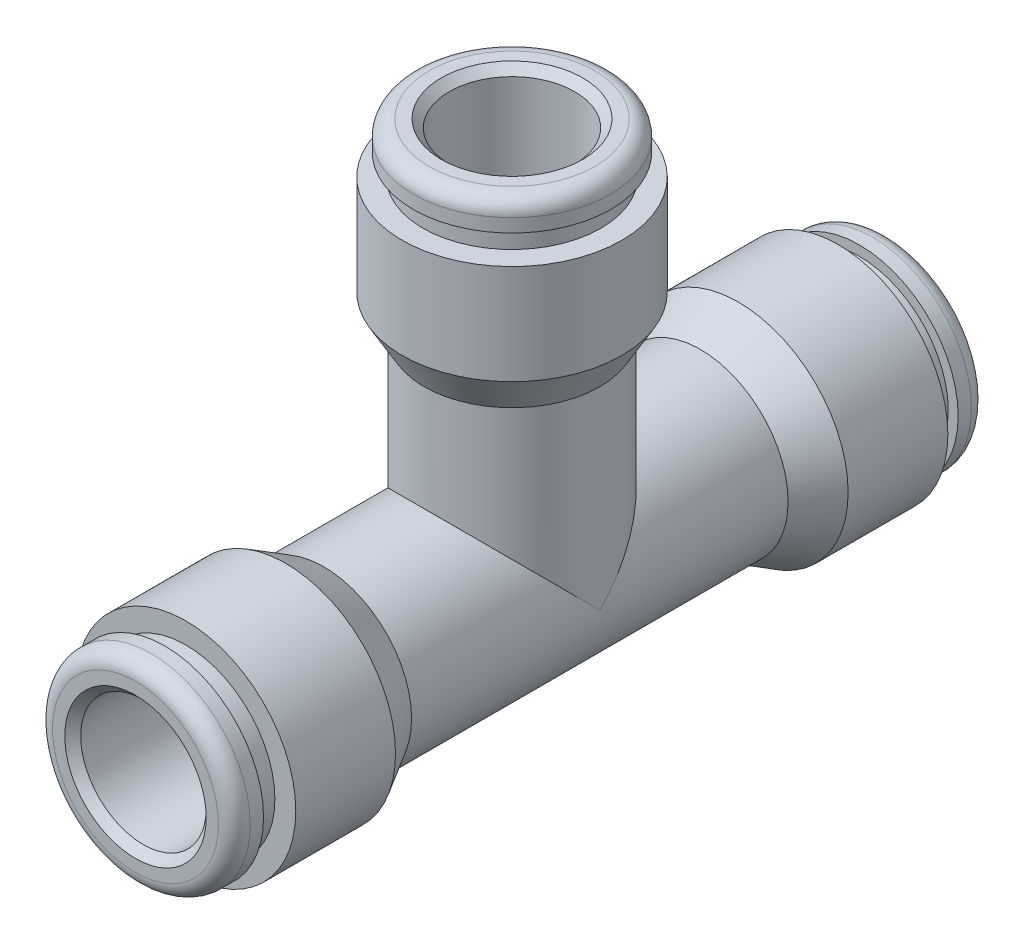
ISO-10303-21;
HEADER;
FILE_DESCRIPTION(('STEP AP214'),'2;1');
FILE_NAME('part.step','',(''),(''),'','','');
FILE_SCHEMA(('AUTOMOTIVE_DESIGN { 1 0 10303 214 1 1 1 1 }'));
ENDSEC;
DATA;
#1=APPLICATION_CONTEXT('core data for automotive mechanical design processes');
#2=APPLICATION_PROTOCOL_DEFINITION('international standard','automotive_design',2000,#1);
#3=PRODUCT_CONTEXT('',#1,'mechanical');
#4=PRODUCT('Part','Part','',(#3));
#5=PRODUCT_RELATED_PRODUCT_CATEGORY('part','',(#4));
#6=PRODUCT_DEFINITION_FORMATION('','',#4);
#7=PRODUCT_DEFINITION_CONTEXT('part definition',#1,'design');
#8=PRODUCT_DEFINITION('design','',#6,#7);
#9=PRODUCT_DEFINITION_SHAPE('','',#8);
#10=(LENGTH_UNIT() NAMED_UNIT(*) SI_UNIT(.MILLI.,.METRE.));
#11=(NAMED_UNIT(*) PLANE_ANGLE_UNIT() SI_UNIT($,.RADIAN.));
#12=(NAMED_UNIT(*) SI_UNIT($,.STERADIAN.) SOLID_ANGLE_UNIT());
#13=UNCERTAINTY_MEASURE_WITH_UNIT(LENGTH_MEASURE(1.E-05),#10,'distance_accuracy_value','');
#14=(GEOMETRIC_REPRESENTATION_CONTEXT(3) GLOBAL_UNCERTAINTY_ASSIGNED_CONTEXT((#13)) GLOBAL_UNIT_ASSIGNED_CONTEXT((#10,
#11,#12)) REPRESENTATION_CONTEXT('',''));
#15=CARTESIAN_POINT('',(0.,0.,0.));
#16=DIRECTION('',(0.,0.,1.));
#17=DIRECTION('',(1.,0.,0.));
#18=AXIS2_PLACEMENT_3D('',#15,#16,#17);
#19=CARTESIAN_POINT('',(0.,0.,0.));
#20=DIRECTION('',(0.,-1.,0.));
#21=DIRECTION('',(0.,0.,-1.));
#22=AXIS2_PLACEMENT_3D('',#19,#20,#21);
#23=CYLINDRICAL_SURFACE('',#22,2.23799999999998);
#24=CARTESIAN_POINT('',(0.,6.,0.));
#25=DIRECTION('',(0.,-1.,0.));
#26=DIRECTION('',(1.,0.,0.));
#27=AXIS2_PLACEMENT_3D('',#24,#25,#26);
#28=CIRCLE('',#27,2.238);
#29=CARTESIAN_POINT('',(2.238,6.,0.));
#30=VERTEX_POINT('',#29);
#31=EDGE_CURVE('E142',#30,#30,#28,.T.);
#32=ORIENTED_EDGE('',*,*,#31,.F.);
#33=EDGE_LOOP('',(#32));
#34=FACE_BOUND('',#33,.T.);
#35=CARTESIAN_POINT('',(0.,0.,0.));
#36=DIRECTION('',(0.,-0.707106781186547,0.707106781186547));
#37=DIRECTION('',(0.,-0.707106781186547,-0.707106781186547));
#38=AXIS2_PLACEMENT_3D('',#35,#36,#37);
#39=ELLIPSE('',#38,3.16500995259097,2.23799999999999);
#40=CARTESIAN_POINT('',(-2.238,0.,0.));
#41=VERTEX_POINT('',#40);
#42=CARTESIAN_POINT('',(2.238,0.,0.));
#43=VERTEX_POINT('',#42);
#44=EDGE_CURVE('E62',#41,#43,#39,.F.);
#45=ORIENTED_EDGE('',*,*,#44,.F.);
#46=CARTESIAN_POINT('',(0.,0.,0.));
#47=DIRECTION('',(0.,-0.707106781186547,-0.707106781186547));
#48=DIRECTION('',(0.,-0.707106781186547,0.707106781186547));
#49=AXIS2_PLACEMENT_3D('',#46,#47,#48);
#50=ELLIPSE('',#49,3.16500995259097,2.23799999999999);
#51=EDGE_CURVE('E66',#43,#41,#50,.F.);
#52=ORIENTED_EDGE('',*,*,#51,.F.);
#53=EDGE_LOOP('',(#45,#52));
#54=FACE_BOUND('',#53,.T.);
#55=ADVANCED_FACE('F39',(#34,#54),#23,.F.);
#56=CARTESIAN_POINT('',(0.,0.,0.));
#57=DIRECTION('',(0.,0.,1.));
#58=DIRECTION('',(1.,0.,0.));
#59=AXIS2_PLACEMENT_3D('',#56,#57,#58);
#60=CYLINDRICAL_SURFACE('',#59,2.238);
#61=ORIENTED_EDGE('',*,*,#44,.T.);
#62=ORIENTED_EDGE('',*,*,#51,.T.);
#63=EDGE_LOOP('',(#61,#62));
#64=FACE_BOUND('',#63,.T.);
#65=CARTESIAN_POINT('',(0.,0.,5.75));
#66=DIRECTION('',(0.,0.,-1.));
#67=DIRECTION('',(1.,0.,0.));
#68=AXIS2_PLACEMENT_3D('',#65,#66,#67);
#69=CIRCLE('',#68,2.238);
#70=CARTESIAN_POINT('',(2.238,0.,5.75));
#71=VERTEX_POINT('',#70);
#72=EDGE_CURVE('E104',#71,#71,#69,.T.);
#73=ORIENTED_EDGE('',*,*,#72,.F.);
#74=EDGE_LOOP('',(#73));
#75=FACE_BOUND('',#74,.T.);
#76=CARTESIAN_POINT('',(0.,0.,-5.75));
#77=DIRECTION('',(0.,0.,1.));
#78=DIRECTION('',(1.,0.,0.));
#79=AXIS2_PLACEMENT_3D('',#76,#77,#78);
#80=CIRCLE('',#79,2.238);
#81=CARTESIAN_POINT('',(2.238,0.,-5.75));
#82=VERTEX_POINT('',#81);
#83=EDGE_CURVE('E47',#82,#82,#80,.T.);
#84=ORIENTED_EDGE('',*,*,#83,.F.);
#85=EDGE_LOOP('',(#84));
#86=FACE_BOUND('',#85,.T.);
#87=ADVANCED_FACE('F64',(#64,#75,#86),#60,.F.);
#88=CARTESIAN_POINT('',(0.,0.,0.));
#89=DIRECTION('',(0.,0.,1.));
#90=DIRECTION('',(1.,0.,0.));
#91=AXIS2_PLACEMENT_3D('',#88,#89,#90);
#92=CYLINDRICAL_SURFACE('',#91,4.2);
#93=CARTESIAN_POINT('',(0.,0.,-9.));
#94=DIRECTION('',(0.,0.,1.));
#95=DIRECTION('',(1.,0.,0.));
#96=AXIS2_PLACEMENT_3D('',#93,#94,#95);
#97=CIRCLE('',#96,4.2);
#98=CARTESIAN_POINT('',(4.2,0.,-9.));
#99=VERTEX_POINT('',#98);
#100=EDGE_CURVE('E175',#99,#99,#97,.T.);
#101=ORIENTED_EDGE('',*,*,#100,.T.);
#102=EDGE_LOOP('',(#101));
#103=FACE_BOUND('',#102,.T.);
#104=CARTESIAN_POINT('',(0.,0.,0.));
#105=DIRECTION('',(0.,0.707106781186546,0.707106781186549));
#106=DIRECTION('',(0.,-0.707106781186549,0.707106781186546));
#107=AXIS2_PLACEMENT_3D('',#104,#105,#106);
#108=ELLIPSE('',#107,5.93969696196699,4.2);
#109=CARTESIAN_POINT('',(4.2,0.,0.));
#110=VERTEX_POINT('',#109);
#111=CARTESIAN_POINT('',(-4.2,0.,0.));
#112=VERTEX_POINT('',#111);
#113=EDGE_CURVE('E11',#110,#112,#108,.T.);
#114=ORIENTED_EDGE('',*,*,#113,.F.);
#115=CARTESIAN_POINT('',(0.,0.,0.));
#116=DIRECTION('',(0.,-0.707106781186551,0.707106781186544));
#117=DIRECTION('',(0.,-0.707106781186544,-0.707106781186551));
#118=AXIS2_PLACEMENT_3D('',#115,#116,#117);
#119=ELLIPSE('',#118,5.93969696196699,4.2);
#120=EDGE_CURVE('E107',#110,#112,#119,.T.);
#121=ORIENTED_EDGE('',*,*,#120,.T.);
#122=EDGE_LOOP('',(#114,#121));
#123=FACE_BOUND('',#122,.T.);
#124=CARTESIAN_POINT('',(0.,0.,9.));
#125=DIRECTION('',(0.,0.,-1.));
#126=DIRECTION('',(1.,0.,0.));
#127=AXIS2_PLACEMENT_3D('',#124,#125,#126);
#128=CIRCLE('',#127,4.2);
#129=CARTESIAN_POINT('',(4.2,0.,9.));
#130=VERTEX_POINT('',#129);
#131=EDGE_CURVE('E101',#130,#130,#128,.T.);
#132=ORIENTED_EDGE('',*,*,#131,.T.);
#133=EDGE_LOOP('',(#132));
#134=FACE_BOUND('',#133,.T.);
#135=ADVANCED_FACE('F182',(#103,#123,#134),#92,.T.);
#136=CARTESIAN_POINT('',(0.,3.,-5.75));
#137=DIRECTION('',(0.,0.,1.));
#138=DIRECTION('',(1.,0.,0.));
#139=AXIS2_PLACEMENT_3D('',#136,#137,#138);
#140=PLANE('',#139);
#141=CARTESIAN_POINT('',(0.,0.,-5.75));
#142=DIRECTION('',(0.,0.,1.));
#143=DIRECTION('',(1.,0.,0.));
#144=AXIS2_PLACEMENT_3D('',#141,#142,#143);
#145=CIRCLE('',#144,3.);
#146=CARTESIAN_POINT('',(3.,0.,-5.75));
#147=VERTEX_POINT('',#146);
#148=EDGE_CURVE('E145',#147,#147,#145,.T.);
#149=ORIENTED_EDGE('',*,*,#148,.F.);
#150=EDGE_LOOP('',(#149));
#151=FACE_BOUND('',#150,.T.);
#152=ORIENTED_EDGE('',*,*,#83,.T.);
#153=EDGE_LOOP('',(#152));
#154=FACE_BOUND('',#153,.T.);
#155=ADVANCED_FACE('F41',(#151,#154),#140,.F.);
#156=CARTESIAN_POINT('',(0.,0.,-10.8186533479473));
#157=DIRECTION('',(0.,0.,-1.));
#158=DIRECTION('',(-1.,0.,0.));
#159=AXIS2_PLACEMENT_3D('',#156,#157,#158);
#160=CONICAL_SURFACE('',#159,5.25,0.523598775598301);
#161=ORIENTED_EDGE('',*,*,#100,.F.);
#162=EDGE_LOOP('',(#161));
#163=FACE_BOUND('',#162,.T.);
#164=CARTESIAN_POINT('',(0.,0.,-10.8186533479473));
#165=DIRECTION('',(0.,0.,1.));
#166=DIRECTION('',(1.,0.,0.));
#167=AXIS2_PLACEMENT_3D('',#164,#165,#166);
#168=CIRCLE('',#167,5.25);
#169=CARTESIAN_POINT('',(5.25,0.,-10.8186533479473));
#170=VERTEX_POINT('',#169);
#171=EDGE_CURVE('E172',#170,#170,#168,.T.);
#172=ORIENTED_EDGE('',*,*,#171,.T.);
#173=EDGE_LOOP('',(#172));
#174=FACE_BOUND('',#173,.T.);
#175=ADVANCED_FACE('F192',(#163,#174),#160,.T.);
#176=CARTESIAN_POINT('',(0.,0.,0.));
#177=DIRECTION('',(0.,0.,1.));
#178=DIRECTION('',(1.,0.,0.));
#179=AXIS2_PLACEMENT_3D('',#176,#177,#178);
#180=CYLINDRICAL_SURFACE('',#179,5.25);
#181=ORIENTED_EDGE('',*,*,#171,.F.);
#182=EDGE_LOOP('',(#181));
#183=FACE_BOUND('',#182,.T.);
#184=CARTESIAN_POINT('',(0.,0.,-15.587));
#185=DIRECTION('',(0.,0.,1.));
#186=DIRECTION('',(1.,0.,0.));
#187=AXIS2_PLACEMENT_3D('',#184,#185,#186);
#188=CIRCLE('',#187,5.25);
#189=CARTESIAN_POINT('',(5.25,0.,-15.587));
#190=VERTEX_POINT('',#189);
#191=EDGE_CURVE('E169',#190,#190,#188,.T.);
#192=ORIENTED_EDGE('',*,*,#191,.T.);
#193=EDGE_LOOP('',(#192));
#194=FACE_BOUND('',#193,.T.);
#195=ADVANCED_FACE('F195',(#183,#194),#180,.T.);
#196=CARTESIAN_POINT('',(0.,5.25,-15.587));
#197=DIRECTION('',(0.,0.,1.));
#198=DIRECTION('',(1.,0.,0.));
#199=AXIS2_PLACEMENT_3D('',#196,#197,#198);
#200=PLANE('',#199);
#201=ORIENTED_EDGE('',*,*,#191,.F.);
#202=EDGE_LOOP('',(#201));
#203=FACE_BOUND('',#202,.T.);
#204=CARTESIAN_POINT('',(0.,0.,-15.587));
#205=DIRECTION('',(0.,0.,1.));
#206=DIRECTION('',(1.,0.,0.));
#207=AXIS2_PLACEMENT_3D('',#204,#205,#206);
#208=CIRCLE('',#207,4.2525);
#209=CARTESIAN_POINT('',(4.2525,0.,-15.587));
#210=VERTEX_POINT('',#209);
#211=EDGE_CURVE('E166',#210,#210,#208,.T.);
#212=ORIENTED_EDGE('',*,*,#211,.T.);
#213=EDGE_LOOP('',(#212));
#214=FACE_BOUND('',#213,.T.);
#215=ADVANCED_FACE('F199',(#203,#214),#200,.F.);
#216=CARTESIAN_POINT('',(0.,0.,0.));
#217=DIRECTION('',(0.,0.,1.));
#218=DIRECTION('',(1.,0.,0.));
#219=AXIS2_PLACEMENT_3D('',#216,#217,#218);
#220=CYLINDRICAL_SURFACE('',#219,4.2525);
#221=ORIENTED_EDGE('',*,*,#211,.F.);
#222=EDGE_LOOP('',(#221));
#223=FACE_BOUND('',#222,.T.);
#224=CARTESIAN_POINT('',(0.,0.,-16.603));
#225=DIRECTION('',(0.,0.,1.));
#226=DIRECTION('',(1.,0.,0.));
#227=AXIS2_PLACEMENT_3D('',#224,#225,#226);
#228=CIRCLE('',#227,4.2525);
#229=CARTESIAN_POINT('',(4.2525,0.,-16.603));
#230=VERTEX_POINT('',#229);
#231=EDGE_CURVE('E163',#230,#230,#228,.T.);
#232=ORIENTED_EDGE('',*,*,#231,.T.);
#233=EDGE_LOOP('',(#232));
#234=FACE_BOUND('',#233,.T.);
#235=ADVANCED_FACE('F203',(#223,#234),#220,.T.);
#236=CARTESIAN_POINT('',(0.,4.725,-16.603));
#237=DIRECTION('',(0.,0.,-1.));
#238=DIRECTION('',(-1.,0.,0.));
#239=AXIS2_PLACEMENT_3D('',#236,#237,#238);
#240=PLANE('',#239);
#241=ORIENTED_EDGE('',*,*,#231,.F.);
#242=EDGE_LOOP('',(#241));
#243=FACE_BOUND('',#242,.T.);
#244=CARTESIAN_POINT('',(0.,0.,-16.603));
#245=DIRECTION('',(0.,0.,1.));
#246=DIRECTION('',(1.,0.,0.));
#247=AXIS2_PLACEMENT_3D('',#244,#245,#246);
#248=CIRCLE('',#247,4.725);
#249=CARTESIAN_POINT('',(4.725,0.,-16.603));
#250=VERTEX_POINT('',#249);
#251=EDGE_CURVE('E160',#250,#250,#248,.T.);
#252=ORIENTED_EDGE('',*,*,#251,.T.);
#253=EDGE_LOOP('',(#252));
#254=FACE_BOUND('',#253,.T.);
#255=ADVANCED_FACE('F207',(#243,#254),#240,.F.);
#256=CARTESIAN_POINT('',(0.,0.,0.));
#257=DIRECTION('',(0.,0.,1.));
#258=DIRECTION('',(1.,0.,0.));
#259=AXIS2_PLACEMENT_3D('',#256,#257,#258);
#260=CYLINDRICAL_SURFACE('',#259,4.725);
#261=ORIENTED_EDGE('',*,*,#251,.F.);
#262=EDGE_LOOP('',(#261));
#263=FACE_BOUND('',#262,.T.);
#264=CARTESIAN_POINT('',(0.,0.,-17.238));
#265=DIRECTION('',(0.,0.,1.));
#266=DIRECTION('',(1.,0.,0.));
#267=AXIS2_PLACEMENT_3D('',#264,#265,#266);
#268=CIRCLE('',#267,4.725);
#269=CARTESIAN_POINT('',(4.725,0.,-17.238));
#270=VERTEX_POINT('',#269);
#271=EDGE_CURVE('E157',#270,#270,#268,.T.);
#272=ORIENTED_EDGE('',*,*,#271,.T.);
#273=EDGE_LOOP('',(#272));
#274=FACE_BOUND('',#273,.T.);
#275=ADVANCED_FACE('F211',(#263,#274),#260,.T.);
#276=CARTESIAN_POINT('',(0.,0.,-17.238));
#277=DIRECTION('',(0.,0.,1.));
#278=DIRECTION('',(1.,0.,0.));
#279=AXIS2_PLACEMENT_3D('',#276,#277,#278);
#280=TOROIDAL_SURFACE('',#279,3.963,0.761999999999999);
#281=ORIENTED_EDGE('',*,*,#271,.F.);
#282=EDGE_LOOP('',(#281));
#283=FACE_BOUND('',#282,.T.);
#284=CARTESIAN_POINT('',(0.,0.,-18.));
#285=DIRECTION('',(0.,0.,1.));
#286=DIRECTION('',(1.,0.,0.));
#287=AXIS2_PLACEMENT_3D('',#284,#285,#286);
#288=CIRCLE('',#287,3.963);
#289=CARTESIAN_POINT('',(3.963,0.,-18.));
#290=VERTEX_POINT('',#289);
#291=EDGE_CURVE('E154',#290,#290,#288,.T.);
#292=ORIENTED_EDGE('',*,*,#291,.T.);
#293=EDGE_LOOP('',(#292));
#294=FACE_BOUND('',#293,.T.);
#295=ADVANCED_FACE('F215',(#283,#294),#280,.T.);
#296=CARTESIAN_POINT('',(0.,3.963,-18.));
#297=DIRECTION('',(0.,0.,1.));
#298=DIRECTION('',(1.,0.,0.));
#299=AXIS2_PLACEMENT_3D('',#296,#297,#298);
#300=PLANE('',#299);
#301=ORIENTED_EDGE('',*,*,#291,.F.);
#302=EDGE_LOOP('',(#301));
#303=FACE_BOUND('',#302,.T.);
#304=CARTESIAN_POINT('',(0.,0.,-18.));
#305=DIRECTION('',(0.,0.,1.));
#306=DIRECTION('',(1.,0.,0.));
#307=AXIS2_PLACEMENT_3D('',#304,#305,#306);
#308=CIRCLE('',#307,3.381);
#309=CARTESIAN_POINT('',(3.381,0.,-18.));
#310=VERTEX_POINT('',#309);
#311=EDGE_CURVE('E151',#310,#310,#308,.T.);
#312=ORIENTED_EDGE('',*,*,#311,.T.);
#313=EDGE_LOOP('',(#312));
#314=FACE_BOUND('',#313,.T.);
#315=ADVANCED_FACE('F219',(#303,#314),#300,.F.);
#316=CARTESIAN_POINT('',(0.,0.,-17.619));
#317=DIRECTION('',(0.,0.,-1.));
#318=DIRECTION('',(-1.,0.,0.));
#319=AXIS2_PLACEMENT_3D('',#316,#317,#318);
#320=CONICAL_SURFACE('',#319,3.,0.785398163397449);
#321=ORIENTED_EDGE('',*,*,#311,.F.);
#322=EDGE_LOOP('',(#321));
#323=FACE_BOUND('',#322,.T.);
#324=CARTESIAN_POINT('',(0.,0.,-17.619));
#325=DIRECTION('',(0.,0.,1.));
#326=DIRECTION('',(1.,0.,0.));
#327=AXIS2_PLACEMENT_3D('',#324,#325,#326);
#328=CIRCLE('',#327,3.);
#329=CARTESIAN_POINT('',(3.,0.,-17.619));
#330=VERTEX_POINT('',#329);
#331=EDGE_CURVE('E148',#330,#330,#328,.T.);
#332=ORIENTED_EDGE('',*,*,#331,.T.);
#333=EDGE_LOOP('',(#332));
#334=FACE_BOUND('',#333,.T.);
#335=ADVANCED_FACE('F223',(#323,#334),#320,.F.);
#336=CARTESIAN_POINT('',(0.,0.,0.));
#337=DIRECTION('',(0.,0.,1.));
#338=DIRECTION('',(1.,0.,0.));
#339=AXIS2_PLACEMENT_3D('',#336,#337,#338);
#340=CYLINDRICAL_SURFACE('',#339,3.);
#341=ORIENTED_EDGE('',*,*,#331,.F.);
#342=EDGE_LOOP('',(#341));
#343=FACE_BOUND('',#342,.T.);
#344=ORIENTED_EDGE('',*,*,#148,.T.);
#345=EDGE_LOOP('',(#344));
#346=FACE_BOUND('',#345,.T.);
#347=ADVANCED_FACE('F227',(#343,#346),#340,.F.);
#348=CARTESIAN_POINT('',(0.,0.,0.));
#349=DIRECTION('',(0.,0.,-1.));
#350=DIRECTION('',(1.,0.,0.));
#351=AXIS2_PLACEMENT_3D('',#348,#349,#350);
#352=CYLINDRICAL_SURFACE('',#351,3.);
#353=CARTESIAN_POINT('',(0.,-1.23032819418154E-13,17.619));
#354=DIRECTION('',(0.,0.,-1.));
#355=DIRECTION('',(1.,0.,0.));
#356=AXIS2_PLACEMENT_3D('',#353,#354,#355);
#357=CIRCLE('',#356,3.);
#358=CARTESIAN_POINT('',(3.,-1.23032819418154E-13,17.619));
#359=VERTEX_POINT('',#358);
#360=EDGE_CURVE('E72',#359,#359,#357,.T.);
#361=ORIENTED_EDGE('',*,*,#360,.F.);
#362=EDGE_LOOP('',(#361));
#363=FACE_BOUND('',#362,.T.);
#364=CARTESIAN_POINT('',(0.,0.,5.75));
#365=DIRECTION('',(0.,0.,-1.));
#366=DIRECTION('',(1.,0.,0.));
#367=AXIS2_PLACEMENT_3D('',#364,#365,#366);
#368=CIRCLE('',#367,3.);
#369=CARTESIAN_POINT('',(3.,0.,5.75));
#370=VERTEX_POINT('',#369);
#371=EDGE_CURVE('E69',#370,#370,#368,.T.);
#372=ORIENTED_EDGE('',*,*,#371,.T.);
#373=EDGE_LOOP('',(#372));
#374=FACE_BOUND('',#373,.T.);
#375=ADVANCED_FACE('F230',(#363,#374),#352,.F.);
#376=CARTESIAN_POINT('',(0.,-1.23032819418154E-13,17.619));
#377=DIRECTION('',(0.,0.,1.));
#378=DIRECTION('',(-1.,0.,0.));
#379=AXIS2_PLACEMENT_3D('',#376,#377,#378);
#380=CONICAL_SURFACE('',#379,3.,0.785398163397449);
#381=CARTESIAN_POINT('',(0.,-1.25693328198353E-13,18.));
#382=DIRECTION('',(0.,0.,-1.));
#383=DIRECTION('',(1.,0.,0.));
#384=AXIS2_PLACEMENT_3D('',#381,#382,#383);
#385=CIRCLE('',#384,3.381);
#386=CARTESIAN_POINT('',(3.381,-1.25693328198353E-13,18.));
#387=VERTEX_POINT('',#386);
#388=EDGE_CURVE('E77',#387,#387,#385,.T.);
#389=ORIENTED_EDGE('',*,*,#388,.F.);
#390=EDGE_LOOP('',(#389));
#391=FACE_BOUND('',#390,.T.);
#392=ORIENTED_EDGE('',*,*,#360,.T.);
#393=EDGE_LOOP('',(#392));
#394=FACE_BOUND('',#393,.T.);
#395=ADVANCED_FACE('F316',(#391,#394),#380,.F.);
#396=CARTESIAN_POINT('',(0.,-3.96300000000013,18.));
#397=DIRECTION('',(0.,0.,-1.));
#398=DIRECTION('',(1.,0.,0.));
#399=AXIS2_PLACEMENT_3D('',#396,#397,#398);
#400=PLANE('',#399);
#401=CARTESIAN_POINT('',(0.,-1.25693328198353E-13,18.));
#402=DIRECTION('',(0.,0.,-1.));
#403=DIRECTION('',(1.,0.,0.));
#404=AXIS2_PLACEMENT_3D('',#401,#402,#403);
#405=CIRCLE('',#404,3.963);
#406=CARTESIAN_POINT('',(3.963,-1.25693328198353E-13,18.));
#407=VERTEX_POINT('',#406);
#408=EDGE_CURVE('E80',#407,#407,#405,.T.);
#409=ORIENTED_EDGE('',*,*,#408,.F.);
#410=EDGE_LOOP('',(#409));
#411=FACE_BOUND('',#410,.T.);
#412=ORIENTED_EDGE('',*,*,#388,.T.);
#413=EDGE_LOOP('',(#412));
#414=FACE_BOUND('',#413,.T.);
#415=ADVANCED_FACE('F312',(#411,#414),#400,.F.);
#416=CARTESIAN_POINT('',(0.,-1.20372310637956E-13,17.238));
#417=DIRECTION('',(0.,0.,-1.));
#418=DIRECTION('',(1.,0.,0.));
#419=AXIS2_PLACEMENT_3D('',#416,#417,#418);
#420=TOROIDAL_SURFACE('',#419,3.963,0.761999999999999);
#421=CARTESIAN_POINT('',(0.,-1.20372310637956E-13,17.238));
#422=DIRECTION('',(0.,0.,-1.));
#423=DIRECTION('',(1.,0.,0.));
#424=AXIS2_PLACEMENT_3D('',#421,#422,#423);
#425=CIRCLE('',#424,4.725);
#426=CARTESIAN_POINT('',(4.725,-1.20372310637956E-13,17.238));
#427=VERTEX_POINT('',#426);
#428=EDGE_CURVE('E83',#427,#427,#425,.T.);
#429=ORIENTED_EDGE('',*,*,#428,.F.);
#430=EDGE_LOOP('',(#429));
#431=FACE_BOUND('',#430,.T.);
#432=ORIENTED_EDGE('',*,*,#408,.T.);
#433=EDGE_LOOP('',(#432));
#434=FACE_BOUND('',#433,.T.);
#435=ADVANCED_FACE('F308',(#431,#434),#420,.T.);
#436=CARTESIAN_POINT('',(0.,0.,0.));
#437=DIRECTION('',(0.,0.,-1.));
#438=DIRECTION('',(1.,0.,0.));
#439=AXIS2_PLACEMENT_3D('',#436,#437,#438);
#440=CYLINDRICAL_SURFACE('',#439,4.725);
#441=CARTESIAN_POINT('',(0.,-1.15938129337625E-13,16.603));
#442=DIRECTION('',(0.,0.,-1.));
#443=DIRECTION('',(1.,0.,0.));
#444=AXIS2_PLACEMENT_3D('',#441,#442,#443);
#445=CIRCLE('',#444,4.725);
#446=CARTESIAN_POINT('',(4.725,-1.15938129337625E-13,16.603));
#447=VERTEX_POINT('',#446);
#448=EDGE_CURVE('E86',#447,#447,#445,.T.);
#449=ORIENTED_EDGE('',*,*,#448,.F.);
#450=EDGE_LOOP('',(#449));
#451=FACE_BOUND('',#450,.T.);
#452=ORIENTED_EDGE('',*,*,#428,.T.);
#453=EDGE_LOOP('',(#452));
#454=FACE_BOUND('',#453,.T.);
#455=ADVANCED_FACE('F304',(#451,#454),#440,.T.);
#456=CARTESIAN_POINT('',(0.,-4.72500000000012,16.603));
#457=DIRECTION('',(0.,0.,1.));
#458=DIRECTION('',(-1.,0.,0.));
#459=AXIS2_PLACEMENT_3D('',#456,#457,#458);
#460=PLANE('',#459);
#461=CARTESIAN_POINT('',(0.,-1.15938129337625E-13,16.603));
#462=DIRECTION('',(0.,0.,-1.));
#463=DIRECTION('',(1.,0.,0.));
#464=AXIS2_PLACEMENT_3D('',#461,#462,#463);
#465=CIRCLE('',#464,4.2525);
#466=CARTESIAN_POINT('',(4.2525,-1.15938129337625E-13,16.603));
#467=VERTEX_POINT('',#466);
#468=EDGE_CURVE('E89',#467,#467,#465,.T.);
#469=ORIENTED_EDGE('',*,*,#468,.F.);
#470=EDGE_LOOP('',(#469));
#471=FACE_BOUND('',#470,.T.);
#472=ORIENTED_EDGE('',*,*,#448,.T.);
#473=EDGE_LOOP('',(#472));
#474=FACE_BOUND('',#473,.T.);
#475=ADVANCED_FACE('F300',(#471,#474),#460,.F.);
#476=CARTESIAN_POINT('',(0.,0.,0.));
#477=DIRECTION('',(0.,0.,-1.));
#478=DIRECTION('',(1.,0.,0.));
#479=AXIS2_PLACEMENT_3D('',#476,#477,#478);
#480=CYLINDRICAL_SURFACE('',#479,4.2525);
#481=CARTESIAN_POINT('',(0.,-1.08843439257096E-13,15.587));
#482=DIRECTION('',(0.,0.,-1.));
#483=DIRECTION('',(1.,0.,0.));
#484=AXIS2_PLACEMENT_3D('',#481,#482,#483);
#485=CIRCLE('',#484,4.2525);
#486=CARTESIAN_POINT('',(4.2525,-1.08843439257096E-13,15.587));
#487=VERTEX_POINT('',#486);
#488=EDGE_CURVE('E92',#487,#487,#485,.T.);
#489=ORIENTED_EDGE('',*,*,#488,.F.);
#490=EDGE_LOOP('',(#489));
#491=FACE_BOUND('',#490,.T.);
#492=ORIENTED_EDGE('',*,*,#468,.T.);
#493=EDGE_LOOP('',(#492));
#494=FACE_BOUND('',#493,.T.);
#495=ADVANCED_FACE('F296',(#491,#494),#480,.T.);
#496=CARTESIAN_POINT('',(0.,-5.25000000000011,15.587));
#497=DIRECTION('',(0.,0.,-1.));
#498=DIRECTION('',(1.,0.,0.));
#499=AXIS2_PLACEMENT_3D('',#496,#497,#498);
#500=PLANE('',#499);
#501=CARTESIAN_POINT('',(0.,-1.08843439257096E-13,15.587));
#502=DIRECTION('',(0.,0.,-1.));
#503=DIRECTION('',(1.,0.,0.));
#504=AXIS2_PLACEMENT_3D('',#501,#502,#503);
#505=CIRCLE('',#504,5.25);
#506=CARTESIAN_POINT('',(5.25,-1.08843439257096E-13,15.587));
#507=VERTEX_POINT('',#506);
#508=EDGE_CURVE('E95',#507,#507,#505,.T.);
#509=ORIENTED_EDGE('',*,*,#508,.F.);
#510=EDGE_LOOP('',(#509));
#511=FACE_BOUND('',#510,.T.);
#512=ORIENTED_EDGE('',*,*,#488,.T.);
#513=EDGE_LOOP('',(#512));
#514=FACE_BOUND('',#513,.T.);
#515=ADVANCED_FACE('F292',(#511,#514),#500,.F.);
#516=CARTESIAN_POINT('',(0.,0.,0.));
#517=DIRECTION('',(0.,0.,-1.));
#518=DIRECTION('',(1.,0.,0.));
#519=AXIS2_PLACEMENT_3D('',#516,#517,#518);
#520=CYLINDRICAL_SURFACE('',#519,5.25);
#521=CARTESIAN_POINT('',(0.,0.,10.8186533479473));
#522=DIRECTION('',(0.,0.,-1.));
#523=DIRECTION('',(1.,0.,0.));
#524=AXIS2_PLACEMENT_3D('',#521,#522,#523);
#525=CIRCLE('',#524,5.25);
#526=CARTESIAN_POINT('',(5.25,0.,10.8186533479473));
#527=VERTEX_POINT('',#526);
#528=EDGE_CURVE('E98',#527,#527,#525,.T.);
#529=ORIENTED_EDGE('',*,*,#528,.F.);
#530=EDGE_LOOP('',(#529));
#531=FACE_BOUND('',#530,.T.);
#532=ORIENTED_EDGE('',*,*,#508,.T.);
#533=EDGE_LOOP('',(#532));
#534=FACE_BOUND('',#533,.T.);
#535=ADVANCED_FACE('F288',(#531,#534),#520,.T.);
#536=CARTESIAN_POINT('',(0.,0.,10.8186533479473));
#537=DIRECTION('',(0.,0.,1.));
#538=DIRECTION('',(-1.,0.,0.));
#539=AXIS2_PLACEMENT_3D('',#536,#537,#538);
#540=CONICAL_SURFACE('',#539,5.25,0.523598775598301);
#541=ORIENTED_EDGE('',*,*,#131,.F.);
#542=EDGE_LOOP('',(#541));
#543=FACE_BOUND('',#542,.T.);
#544=ORIENTED_EDGE('',*,*,#528,.T.);
#545=EDGE_LOOP('',(#544));
#546=FACE_BOUND('',#545,.T.);
#547=ADVANCED_FACE('F284',(#543,#546),#540,.T.);
#548=CARTESIAN_POINT('',(0.,-3.00000000000004,5.74999999999998));
#549=DIRECTION('',(0.,0.,-1.));
#550=DIRECTION('',(1.,0.,0.));
#551=AXIS2_PLACEMENT_3D('',#548,#549,#550);
#552=PLANE('',#551);
#553=ORIENTED_EDGE('',*,*,#371,.F.);
#554=EDGE_LOOP('',(#553));
#555=FACE_BOUND('',#554,.T.);
#556=ORIENTED_EDGE('',*,*,#72,.T.);
#557=EDGE_LOOP('',(#556));
#558=FACE_BOUND('',#557,.T.);
#559=ADVANCED_FACE('F280',(#555,#558),#552,.F.);
#560=CARTESIAN_POINT('',(0.,0.25,0.));
#561=DIRECTION('',(0.,-1.,0.));
#562=DIRECTION('',(1.,0.,0.));
#563=AXIS2_PLACEMENT_3D('',#560,#561,#562);
#564=CYLINDRICAL_SURFACE('',#563,3.);
#565=CARTESIAN_POINT('',(0.,17.869,0.));
#566=DIRECTION('',(0.,-1.,0.));
#567=DIRECTION('',(1.,0.,0.));
#568=AXIS2_PLACEMENT_3D('',#565,#566,#567);
#569=CIRCLE('',#568,3.);
#570=CARTESIAN_POINT('',(3.,17.869,0.));
#571=VERTEX_POINT('',#570);
#572=EDGE_CURVE('E112',#571,#571,#569,.T.);
#573=ORIENTED_EDGE('',*,*,#572,.F.);
#574=EDGE_LOOP('',(#573));
#575=FACE_BOUND('',#574,.T.);
#576=CARTESIAN_POINT('',(0.,6.,0.));
#577=DIRECTION('',(0.,-1.,0.));
#578=DIRECTION('',(1.,0.,0.));
#579=AXIS2_PLACEMENT_3D('',#576,#577,#578);
#580=CIRCLE('',#579,3.);
#581=CARTESIAN_POINT('',(3.,6.,0.));
#582=VERTEX_POINT('',#581);
#583=EDGE_CURVE('E109',#582,#582,#580,.T.);
#584=ORIENTED_EDGE('',*,*,#583,.T.);
#585=EDGE_LOOP('',(#584));
#586=FACE_BOUND('',#585,.T.);
#587=ADVANCED_FACE('F276',(#575,#586),#564,.F.);
#588=CARTESIAN_POINT('',(0.,17.869,0.));
#589=DIRECTION('',(0.,1.,0.));
#590=DIRECTION('',(-1.,0.,0.));
#591=AXIS2_PLACEMENT_3D('',#588,#589,#590);
#592=CONICAL_SURFACE('',#591,3.,0.785398163397449);
#593=CARTESIAN_POINT('',(0.,18.25,0.));
#594=DIRECTION('',(0.,-1.,0.));
#595=DIRECTION('',(1.,0.,0.));
#596=AXIS2_PLACEMENT_3D('',#593,#594,#595);
#597=CIRCLE('',#596,3.381);
#598=CARTESIAN_POINT('',(3.381,18.25,0.));
#599=VERTEX_POINT('',#598);
#600=EDGE_CURVE('E115',#599,#599,#597,.T.);
#601=ORIENTED_EDGE('',*,*,#600,.F.);
#602=EDGE_LOOP('',(#601));
#603=FACE_BOUND('',#602,.T.);
#604=ORIENTED_EDGE('',*,*,#572,.T.);
#605=EDGE_LOOP('',(#604));
#606=FACE_BOUND('',#605,.T.);
#607=ADVANCED_FACE('F272',(#603,#606),#592,.F.);
#608=CARTESIAN_POINT('',(0.,18.25,3.96300000000006));
#609=DIRECTION('',(0.,-1.,0.));
#610=DIRECTION('',(1.,0.,0.));
#611=AXIS2_PLACEMENT_3D('',#608,#609,#610);
#612=PLANE('',#611);
#613=CARTESIAN_POINT('',(0.,18.25,0.));
#614=DIRECTION('',(0.,-1.,0.));
#615=DIRECTION('',(1.,0.,0.));
#616=AXIS2_PLACEMENT_3D('',#613,#614,#615);
#617=CIRCLE('',#616,3.963);
#618=CARTESIAN_POINT('',(3.963,18.25,0.));
#619=VERTEX_POINT('',#618);
#620=EDGE_CURVE('E118',#619,#619,#617,.T.);
#621=ORIENTED_EDGE('',*,*,#620,.F.);
#622=EDGE_LOOP('',(#621));
#623=FACE_BOUND('',#622,.T.);
#624=ORIENTED_EDGE('',*,*,#600,.T.);
#625=EDGE_LOOP('',(#624));
#626=FACE_BOUND('',#625,.T.);
#627=ADVANCED_FACE('F268',(#623,#626),#612,.F.);
#628=CARTESIAN_POINT('',(0.,17.488,0.));
#629=DIRECTION('',(0.,-1.,0.));
#630=DIRECTION('',(1.,0.,0.));
#631=AXIS2_PLACEMENT_3D('',#628,#629,#630);
#632=TOROIDAL_SURFACE('',#631,3.963,0.761999999999999);
#633=CARTESIAN_POINT('',(0.,17.488,0.));
#634=DIRECTION('',(0.,-1.,0.));
#635=DIRECTION('',(1.,0.,0.));
#636=AXIS2_PLACEMENT_3D('',#633,#634,#635);
#637=CIRCLE('',#636,4.725);
#638=CARTESIAN_POINT('',(4.725,17.488,0.));
#639=VERTEX_POINT('',#638);
#640=EDGE_CURVE('E121',#639,#639,#637,.T.);
#641=ORIENTED_EDGE('',*,*,#640,.F.);
#642=EDGE_LOOP('',(#641));
#643=FACE_BOUND('',#642,.T.);
#644=ORIENTED_EDGE('',*,*,#620,.T.);
#645=EDGE_LOOP('',(#644));
#646=FACE_BOUND('',#645,.T.);
#647=ADVANCED_FACE('F264',(#643,#646),#632,.T.);
#648=CARTESIAN_POINT('',(0.,0.25,0.));
#649=DIRECTION('',(0.,-1.,0.));
#650=DIRECTION('',(1.,0.,0.));
#651=AXIS2_PLACEMENT_3D('',#648,#649,#650);
#652=CYLINDRICAL_SURFACE('',#651,4.725);
#653=CARTESIAN_POINT('',(0.,16.853,0.));
#654=DIRECTION('',(0.,-1.,0.));
#655=DIRECTION('',(1.,0.,0.));
#656=AXIS2_PLACEMENT_3D('',#653,#654,#655);
#657=CIRCLE('',#656,4.725);
#658=CARTESIAN_POINT('',(4.725,16.853,0.));
#659=VERTEX_POINT('',#658);
#660=EDGE_CURVE('E124',#659,#659,#657,.T.);
#661=ORIENTED_EDGE('',*,*,#660,.F.);
#662=EDGE_LOOP('',(#661));
#663=FACE_BOUND('',#662,.T.);
#664=ORIENTED_EDGE('',*,*,#640,.T.);
#665=EDGE_LOOP('',(#664));
#666=FACE_BOUND('',#665,.T.);
#667=ADVANCED_FACE('F260',(#663,#666),#652,.T.);
#668=CARTESIAN_POINT('',(0.,16.853,4.72500000000006));
#669=DIRECTION('',(0.,1.,0.));
#670=DIRECTION('',(-1.,0.,0.));
#671=AXIS2_PLACEMENT_3D('',#668,#669,#670);
#672=PLANE('',#671);
#673=CARTESIAN_POINT('',(0.,16.853,0.));
#674=DIRECTION('',(0.,-1.,0.));
#675=DIRECTION('',(1.,0.,0.));
#676=AXIS2_PLACEMENT_3D('',#673,#674,#675);
#677=CIRCLE('',#676,4.2525);
#678=CARTESIAN_POINT('',(4.2525,16.853,0.));
#679=VERTEX_POINT('',#678);
#680=EDGE_CURVE('E127',#679,#679,#677,.T.);
#681=ORIENTED_EDGE('',*,*,#680,.F.);
#682=EDGE_LOOP('',(#681));
#683=FACE_BOUND('',#682,.T.);
#684=ORIENTED_EDGE('',*,*,#660,.T.);
#685=EDGE_LOOP('',(#684));
#686=FACE_BOUND('',#685,.T.);
#687=ADVANCED_FACE('F256',(#683,#686),#672,.F.);
#688=CARTESIAN_POINT('',(0.,0.25,0.));
#689=DIRECTION('',(0.,-1.,0.));
#690=DIRECTION('',(1.,0.,0.));
#691=AXIS2_PLACEMENT_3D('',#688,#689,#690);
#692=CYLINDRICAL_SURFACE('',#691,4.2525);
#693=CARTESIAN_POINT('',(0.,15.837,0.));
#694=DIRECTION('',(0.,-1.,0.));
#695=DIRECTION('',(1.,0.,0.));
#696=AXIS2_PLACEMENT_3D('',#693,#694,#695);
#697=CIRCLE('',#696,4.2525);
#698=CARTESIAN_POINT('',(4.2525,15.837,0.));
#699=VERTEX_POINT('',#698);
#700=EDGE_CURVE('E130',#699,#699,#697,.T.);
#701=ORIENTED_EDGE('',*,*,#700,.F.);
#702=EDGE_LOOP('',(#701));
#703=FACE_BOUND('',#702,.T.);
#704=ORIENTED_EDGE('',*,*,#680,.T.);
#705=EDGE_LOOP('',(#704));
#706=FACE_BOUND('',#705,.T.);
#707=ADVANCED_FACE('F252',(#703,#706),#692,.T.);
#708=CARTESIAN_POINT('',(0.,15.837,5.25000000000006));
#709=DIRECTION('',(0.,-1.,0.));
#710=DIRECTION('',(1.,0.,0.));
#711=AXIS2_PLACEMENT_3D('',#708,#709,#710);
#712=PLANE('',#711);
#713=CARTESIAN_POINT('',(0.,15.837,0.));
#714=DIRECTION('',(0.,-1.,0.));
#715=DIRECTION('',(1.,0.,0.));
#716=AXIS2_PLACEMENT_3D('',#713,#714,#715);
#717=CIRCLE('',#716,5.25);
#718=CARTESIAN_POINT('',(5.25,15.837,0.));
#719=VERTEX_POINT('',#718);
#720=EDGE_CURVE('E133',#719,#719,#717,.T.);
#721=ORIENTED_EDGE('',*,*,#720,.F.);
#722=EDGE_LOOP('',(#721));
#723=FACE_BOUND('',#722,.T.);
#724=ORIENTED_EDGE('',*,*,#700,.T.);
#725=EDGE_LOOP('',(#724));
#726=FACE_BOUND('',#725,.T.);
#727=ADVANCED_FACE('F248',(#723,#726),#712,.F.);
#728=CARTESIAN_POINT('',(0.,0.25,0.));
#729=DIRECTION('',(0.,-1.,0.));
#730=DIRECTION('',(1.,0.,0.));
#731=AXIS2_PLACEMENT_3D('',#728,#729,#730);
#732=CYLINDRICAL_SURFACE('',#731,5.25);
#733=CARTESIAN_POINT('',(0.,11.0686533479473,0.));
#734=DIRECTION('',(0.,-1.,0.));
#735=DIRECTION('',(1.,0.,0.));
#736=AXIS2_PLACEMENT_3D('',#733,#734,#735);
#737=CIRCLE('',#736,5.25);
#738=CARTESIAN_POINT('',(5.25,11.0686533479473,0.));
#739=VERTEX_POINT('',#738);
#740=EDGE_CURVE('E136',#739,#739,#737,.T.);
#741=ORIENTED_EDGE('',*,*,#740,.F.);
#742=EDGE_LOOP('',(#741));
#743=FACE_BOUND('',#742,.T.);
#744=ORIENTED_EDGE('',*,*,#720,.T.);
#745=EDGE_LOOP('',(#744));
#746=FACE_BOUND('',#745,.T.);
#747=ADVANCED_FACE('F244',(#743,#746),#732,.T.);
#748=CARTESIAN_POINT('',(0.,11.0686533479473,0.));
#749=DIRECTION('',(0.,1.,0.));
#750=DIRECTION('',(-1.,0.,0.));
#751=AXIS2_PLACEMENT_3D('',#748,#749,#750);
#752=CONICAL_SURFACE('',#751,5.25,0.523598775598301);
#753=CARTESIAN_POINT('',(0.,9.25,0.));
#754=DIRECTION('',(0.,-1.,0.));
#755=DIRECTION('',(1.,0.,0.));
#756=AXIS2_PLACEMENT_3D('',#753,#754,#755);
#757=CIRCLE('',#756,4.2);
#758=CARTESIAN_POINT('',(4.2,9.25,0.));
#759=VERTEX_POINT('',#758);
#760=EDGE_CURVE('E139',#759,#759,#757,.T.);
#761=ORIENTED_EDGE('',*,*,#760,.F.);
#762=EDGE_LOOP('',(#761));
#763=FACE_BOUND('',#762,.T.);
#764=ORIENTED_EDGE('',*,*,#740,.T.);
#765=EDGE_LOOP('',(#764));
#766=FACE_BOUND('',#765,.T.);
#767=ADVANCED_FACE('F237',(#763,#766),#752,.T.);
#768=CARTESIAN_POINT('',(0.,5.99999999999999,3.00000000000002));
#769=DIRECTION('',(0.,-1.,0.));
#770=DIRECTION('',(1.,0.,0.));
#771=AXIS2_PLACEMENT_3D('',#768,#769,#770);
#772=PLANE('',#771);
#773=ORIENTED_EDGE('',*,*,#583,.F.);
#774=EDGE_LOOP('',(#773));
#775=FACE_BOUND('',#774,.T.);
#776=ORIENTED_EDGE('',*,*,#31,.T.);
#777=EDGE_LOOP('',(#776));
#778=FACE_BOUND('',#777,.T.);
#779=ADVANCED_FACE('F233',(#775,#778),#772,.F.);
#780=CARTESIAN_POINT('',(0.,0.25,0.));
#781=DIRECTION('',(0.,-1.,0.));
#782=DIRECTION('',(1.,0.,0.));
#783=AXIS2_PLACEMENT_3D('',#780,#781,#782);
#784=CYLINDRICAL_SURFACE('',#783,4.2);
#785=ORIENTED_EDGE('',*,*,#760,.T.);
#786=EDGE_LOOP('',(#785));
#787=FACE_BOUND('',#786,.T.);
#788=ORIENTED_EDGE('',*,*,#120,.F.);
#789=ORIENTED_EDGE('',*,*,#113,.T.);
#790=EDGE_LOOP('',(#788,#789));
#791=FACE_BOUND('',#790,.T.);
#792=ADVANCED_FACE('F236',(#787,#791),#784,.T.);
#793=CLOSED_SHELL('',(#55,#87,#135,#155,#175,#195,#215,#235,#255,#275,#295,#315,#335,#347,#375,
#395,#415,#435,#455,#475,#495,#515,#535,#547,#559,#587,#607,#627,#647,#667,#687,#707,#727,#747,
#767,#779,#792));
#794=MANIFOLD_SOLID_BREP('B2',#793);
#795=ADVANCED_BREP_SHAPE_REPRESENTATION('',(#18,#794),#14);
#796=SHAPE_DEFINITION_REPRESENTATION(#9,#795);
ENDSEC;
END-ISO-10303-21;
